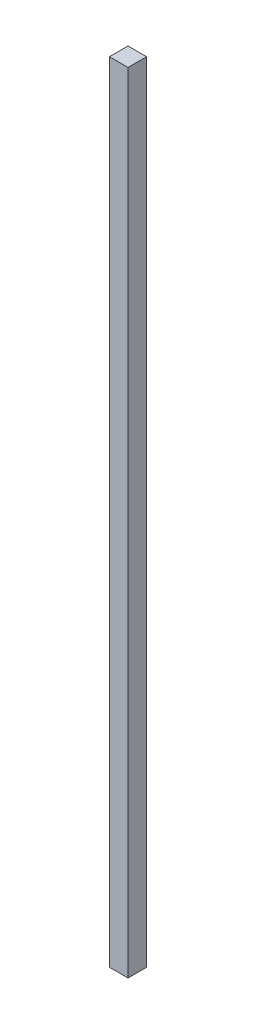
ISO-10303-21;
HEADER;
FILE_DESCRIPTION(('STEP AP214'),'2;1');
FILE_NAME('part.step','',(''),(''),'','','');
FILE_SCHEMA(('AUTOMOTIVE_DESIGN { 1 0 10303 214 1 1 1 1 }'));
ENDSEC;
DATA;
#1=APPLICATION_CONTEXT('core data for automotive mechanical design processes');
#2=APPLICATION_PROTOCOL_DEFINITION('international standard','automotive_design',2000,#1);
#3=PRODUCT_CONTEXT('',#1,'mechanical');
#4=PRODUCT('Part','Part','',(#3));
#5=PRODUCT_RELATED_PRODUCT_CATEGORY('part','',(#4));
#6=PRODUCT_DEFINITION_FORMATION('','',#4);
#7=PRODUCT_DEFINITION_CONTEXT('part definition',#1,'design');
#8=PRODUCT_DEFINITION('design','',#6,#7);
#9=PRODUCT_DEFINITION_SHAPE('','',#8);
#10=(LENGTH_UNIT() NAMED_UNIT(*) SI_UNIT(.MILLI.,.METRE.));
#11=(NAMED_UNIT(*) PLANE_ANGLE_UNIT() SI_UNIT($,.RADIAN.));
#12=(NAMED_UNIT(*) SI_UNIT($,.STERADIAN.) SOLID_ANGLE_UNIT());
#13=UNCERTAINTY_MEASURE_WITH_UNIT(LENGTH_MEASURE(1.E-05),#10,'distance_accuracy_value','');
#14=(GEOMETRIC_REPRESENTATION_CONTEXT(3) GLOBAL_UNCERTAINTY_ASSIGNED_CONTEXT((#13)) GLOBAL_UNIT_ASSIGNED_CONTEXT((#10,
#11,#12)) REPRESENTATION_CONTEXT('',''));
#15=CARTESIAN_POINT('',(0.,0.,0.));
#16=DIRECTION('',(0.,0.,1.));
#17=DIRECTION('',(1.,0.,0.));
#18=AXIS2_PLACEMENT_3D('',#15,#16,#17);
#19=CARTESIAN_POINT('',(10.,850.,-10.));
#20=DIRECTION('',(-1.,0.,0.));
#21=DIRECTION('',(0.,0.,1.));
#22=AXIS2_PLACEMENT_3D('',#19,#20,#21);
#23=PLANE('',#22);
#24=DIRECTION('',(0.,0.,-1.));
#25=VECTOR('',#24,1.);
#26=CARTESIAN_POINT('',(10.,0.,-10.));
#27=LINE('',#26,#25);
#28=CARTESIAN_POINT('',(10.,0.,9.99999999999999));
#29=VERTEX_POINT('',#28);
#30=CARTESIAN_POINT('',(10.,0.,-10.));
#31=VERTEX_POINT('',#30);
#32=EDGE_CURVE('E96',#29,#31,#27,.T.);
#33=ORIENTED_EDGE('',*,*,#32,.T.);
#34=DIRECTION('',(0.,-1.,0.));
#35=VECTOR('',#34,1.);
#36=CARTESIAN_POINT('',(10.,850.,-10.));
#37=LINE('',#36,#35);
#38=CARTESIAN_POINT('',(10.,850.,-10.));
#39=VERTEX_POINT('',#38);
#40=EDGE_CURVE('E11',#39,#31,#37,.T.);
#41=ORIENTED_EDGE('',*,*,#40,.F.);
#42=DIRECTION('',(0.,0.,-1.));
#43=VECTOR('',#42,1.);
#44=CARTESIAN_POINT('',(10.,850.,-10.));
#45=LINE('',#44,#43);
#46=CARTESIAN_POINT('',(10.,850.,9.99999999999999));
#47=VERTEX_POINT('',#46);
#48=EDGE_CURVE('E84',#47,#39,#45,.T.);
#49=ORIENTED_EDGE('',*,*,#48,.F.);
#50=DIRECTION('',(0.,-1.,0.));
#51=VECTOR('',#50,1.);
#52=CARTESIAN_POINT('',(10.,850.,9.99999999999999));
#53=LINE('',#52,#51);
#54=EDGE_CURVE('E92',#47,#29,#53,.T.);
#55=ORIENTED_EDGE('',*,*,#54,.T.);
#56=EDGE_LOOP('',(#33,#41,#49,#55));
#57=FACE_BOUND('',#56,.T.);
#58=ADVANCED_FACE('F33',(#57),#23,.F.);
#59=CARTESIAN_POINT('',(-10.,850.,-10.));
#60=DIRECTION('',(0.,0.,1.));
#61=DIRECTION('',(1.,0.,0.));
#62=AXIS2_PLACEMENT_3D('',#59,#60,#61);
#63=PLANE('',#62);
#64=DIRECTION('',(-1.,0.,0.));
#65=VECTOR('',#64,1.);
#66=CARTESIAN_POINT('',(-10.,0.,-10.));
#67=LINE('',#66,#65);
#68=CARTESIAN_POINT('',(-10.,0.,-10.));
#69=VERTEX_POINT('',#68);
#70=EDGE_CURVE('E88',#31,#69,#67,.T.);
#71=ORIENTED_EDGE('',*,*,#70,.T.);
#72=DIRECTION('',(0.,-1.,0.));
#73=VECTOR('',#72,1.);
#74=CARTESIAN_POINT('',(-10.,850.,-10.));
#75=LINE('',#74,#73);
#76=CARTESIAN_POINT('',(-10.,850.,-10.));
#77=VERTEX_POINT('',#76);
#78=EDGE_CURVE('E41',#77,#69,#75,.T.);
#79=ORIENTED_EDGE('',*,*,#78,.F.);
#80=DIRECTION('',(-1.,0.,0.));
#81=VECTOR('',#80,1.);
#82=CARTESIAN_POINT('',(-10.,850.,-10.));
#83=LINE('',#82,#81);
#84=EDGE_CURVE('E79',#39,#77,#83,.T.);
#85=ORIENTED_EDGE('',*,*,#84,.F.);
#86=ORIENTED_EDGE('',*,*,#40,.T.);
#87=EDGE_LOOP('',(#71,#79,#85,#86));
#88=FACE_BOUND('',#87,.T.);
#89=ADVANCED_FACE('F87',(#88),#63,.F.);
#90=CARTESIAN_POINT('',(-10.,850.,-10.));
#91=DIRECTION('',(1.,0.,0.));
#92=DIRECTION('',(0.,0.,-1.));
#93=AXIS2_PLACEMENT_3D('',#90,#91,#92);
#94=PLANE('',#93);
#95=DIRECTION('',(0.,0.,1.));
#96=VECTOR('',#95,1.);
#97=CARTESIAN_POINT('',(-10.,0.,-10.));
#98=LINE('',#97,#96);
#99=CARTESIAN_POINT('',(-10.,0.,9.99999999999999));
#100=VERTEX_POINT('',#99);
#101=EDGE_CURVE('E66',#69,#100,#98,.T.);
#102=ORIENTED_EDGE('',*,*,#101,.T.);
#103=DIRECTION('',(0.,-1.,0.));
#104=VECTOR('',#103,1.);
#105=CARTESIAN_POINT('',(-10.,850.,9.99999999999999));
#106=LINE('',#105,#104);
#107=CARTESIAN_POINT('',(-10.,850.,9.99999999999999));
#108=VERTEX_POINT('',#107);
#109=EDGE_CURVE('E89',#108,#100,#106,.T.);
#110=ORIENTED_EDGE('',*,*,#109,.F.);
#111=DIRECTION('',(0.,0.,1.));
#112=VECTOR('',#111,1.);
#113=CARTESIAN_POINT('',(-10.,850.,-10.));
#114=LINE('',#113,#112);
#115=EDGE_CURVE('E82',#77,#108,#114,.T.);
#116=ORIENTED_EDGE('',*,*,#115,.F.);
#117=ORIENTED_EDGE('',*,*,#78,.T.);
#118=EDGE_LOOP('',(#102,#110,#116,#117));
#119=FACE_BOUND('',#118,.T.);
#120=ADVANCED_FACE('F90',(#119),#94,.F.);
#121=CARTESIAN_POINT('',(-10.,850.,9.99999999999999));
#122=DIRECTION('',(0.,0.,-1.));
#123=DIRECTION('',(-1.,0.,0.));
#124=AXIS2_PLACEMENT_3D('',#121,#122,#123);
#125=PLANE('',#124);
#126=DIRECTION('',(1.,0.,0.));
#127=VECTOR('',#126,1.);
#128=CARTESIAN_POINT('',(-10.,0.,9.99999999999999));
#129=LINE('',#128,#127);
#130=EDGE_CURVE('E72',#100,#29,#129,.T.);
#131=ORIENTED_EDGE('',*,*,#130,.T.);
#132=ORIENTED_EDGE('',*,*,#54,.F.);
#133=DIRECTION('',(1.,0.,0.));
#134=VECTOR('',#133,1.);
#135=CARTESIAN_POINT('',(-10.,850.,9.99999999999999));
#136=LINE('',#135,#134);
#137=EDGE_CURVE('E49',#108,#47,#136,.T.);
#138=ORIENTED_EDGE('',*,*,#137,.F.);
#139=ORIENTED_EDGE('',*,*,#109,.T.);
#140=EDGE_LOOP('',(#131,#132,#138,#139));
#141=FACE_BOUND('',#140,.T.);
#142=ADVANCED_FACE('F103',(#141),#125,.F.);
#143=CARTESIAN_POINT('',(0.,850.,0.));
#144=DIRECTION('',(0.,1.,0.));
#145=DIRECTION('',(0.,0.,1.));
#146=AXIS2_PLACEMENT_3D('',#143,#144,#145);
#147=PLANE('',#146);
#148=ORIENTED_EDGE('',*,*,#48,.T.);
#149=ORIENTED_EDGE('',*,*,#84,.T.);
#150=ORIENTED_EDGE('',*,*,#115,.T.);
#151=ORIENTED_EDGE('',*,*,#137,.T.);
#152=EDGE_LOOP('',(#148,#149,#150,#151));
#153=FACE_BOUND('',#152,.T.);
#154=ADVANCED_FACE('F80',(#153),#147,.T.);
#155=CARTESIAN_POINT('',(0.,0.,0.));
#156=DIRECTION('',(0.,1.,0.));
#157=DIRECTION('',(0.,0.,1.));
#158=AXIS2_PLACEMENT_3D('',#155,#156,#157);
#159=PLANE('',#158);
#160=ORIENTED_EDGE('',*,*,#32,.F.);
#161=ORIENTED_EDGE('',*,*,#130,.F.);
#162=ORIENTED_EDGE('',*,*,#101,.F.);
#163=ORIENTED_EDGE('',*,*,#70,.F.);
#164=EDGE_LOOP('',(#160,#161,#162,#163));
#165=FACE_BOUND('',#164,.T.);
#166=ADVANCED_FACE('F106',(#165),#159,.F.);
#167=CLOSED_SHELL('',(#58,#89,#120,#142,#154,#166));
#168=MANIFOLD_SOLID_BREP('B2',#167);
#169=ADVANCED_BREP_SHAPE_REPRESENTATION('',(#18,#168),#14);
#170=SHAPE_DEFINITION_REPRESENTATION(#9,#169);
ENDSEC;
END-ISO-10303-21;
